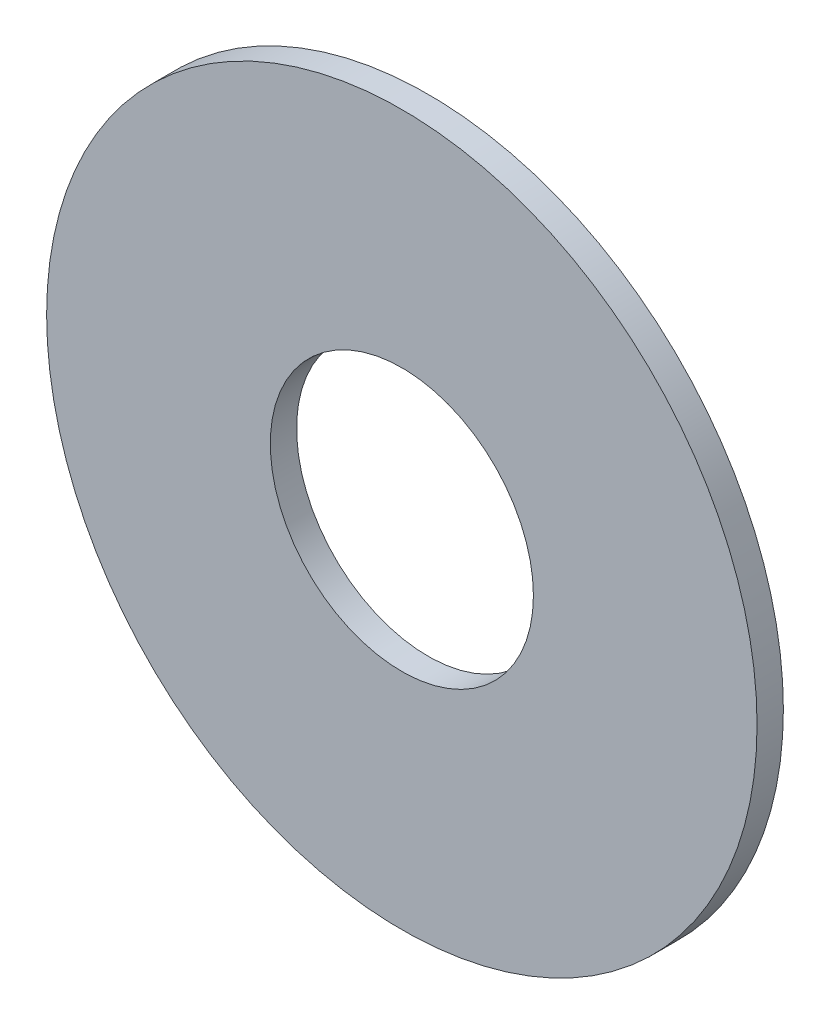
ISO-10303-21;
HEADER;
FILE_DESCRIPTION(('STEP AP214'),'2;1');
FILE_NAME('part.step','',(''),(''),'','','');
FILE_SCHEMA(('AUTOMOTIVE_DESIGN { 1 0 10303 214 1 1 1 1 }'));
ENDSEC;
DATA;
#1=APPLICATION_CONTEXT('core data for automotive mechanical design processes');
#2=APPLICATION_PROTOCOL_DEFINITION('international standard','automotive_design',2000,#1);
#3=PRODUCT_CONTEXT('',#1,'mechanical');
#4=PRODUCT('Part','Part','',(#3));
#5=PRODUCT_RELATED_PRODUCT_CATEGORY('part','',(#4));
#6=PRODUCT_DEFINITION_FORMATION('','',#4);
#7=PRODUCT_DEFINITION_CONTEXT('part definition',#1,'design');
#8=PRODUCT_DEFINITION('design','',#6,#7);
#9=PRODUCT_DEFINITION_SHAPE('','',#8);
#10=(LENGTH_UNIT() NAMED_UNIT(*) SI_UNIT(.MILLI.,.METRE.));
#11=(NAMED_UNIT(*) PLANE_ANGLE_UNIT() SI_UNIT($,.RADIAN.));
#12=(NAMED_UNIT(*) SI_UNIT($,.STERADIAN.) SOLID_ANGLE_UNIT());
#13=UNCERTAINTY_MEASURE_WITH_UNIT(LENGTH_MEASURE(1.E-05),#10,'distance_accuracy_value','');
#14=(GEOMETRIC_REPRESENTATION_CONTEXT(3) GLOBAL_UNCERTAINTY_ASSIGNED_CONTEXT((#13)) GLOBAL_UNIT_ASSIGNED_CONTEXT((#10,
#11,#12)) REPRESENTATION_CONTEXT('',''));
#15=CARTESIAN_POINT('',(0.,0.,0.));
#16=DIRECTION('',(0.,0.,1.));
#17=DIRECTION('',(1.,0.,0.));
#18=AXIS2_PLACEMENT_3D('',#15,#16,#17);
#19=CARTESIAN_POINT('',(0.,0.,2.));
#20=DIRECTION('',(0.,0.,1.));
#21=DIRECTION('',(1.,0.,0.));
#22=AXIS2_PLACEMENT_3D('',#19,#20,#21);
#23=PLANE('',#22);
#24=CARTESIAN_POINT('',(0.,0.,2.));
#25=DIRECTION('',(0.,0.,1.));
#26=DIRECTION('',(1.,0.,0.));
#27=AXIS2_PLACEMENT_3D('',#24,#25,#26);
#28=CIRCLE('',#27,27.);
#29=CARTESIAN_POINT('',(27.,0.,2.));
#30=VERTEX_POINT('',#29);
#31=EDGE_CURVE('E10',#30,#30,#28,.T.);
#32=ORIENTED_EDGE('',*,*,#31,.T.);
#33=EDGE_LOOP('',(#32));
#34=FACE_BOUND('',#33,.T.);
#35=CARTESIAN_POINT('',(0.,0.,2.));
#36=DIRECTION('',(0.,0.,1.));
#37=DIRECTION('',(1.,0.,0.));
#38=AXIS2_PLACEMENT_3D('',#35,#36,#37);
#39=CIRCLE('',#38,10.);
#40=CARTESIAN_POINT('',(10.,0.,2.));
#41=VERTEX_POINT('',#40);
#42=EDGE_CURVE('E41',#41,#41,#39,.T.);
#43=ORIENTED_EDGE('',*,*,#42,.F.);
#44=EDGE_LOOP('',(#43));
#45=FACE_BOUND('',#44,.T.);
#46=ADVANCED_FACE('F30',(#34,#45),#23,.T.);
#47=CARTESIAN_POINT('',(0.,0.,0.));
#48=DIRECTION('',(0.,0.,1.));
#49=DIRECTION('',(1.,0.,0.));
#50=AXIS2_PLACEMENT_3D('',#47,#48,#49);
#51=PLANE('',#50);
#52=CARTESIAN_POINT('',(0.,0.,0.));
#53=DIRECTION('',(0.,0.,1.));
#54=DIRECTION('',(1.,0.,0.));
#55=AXIS2_PLACEMENT_3D('',#52,#53,#54);
#56=CIRCLE('',#55,27.);
#57=CARTESIAN_POINT('',(27.,0.,0.));
#58=VERTEX_POINT('',#57);
#59=EDGE_CURVE('E34',#58,#58,#56,.T.);
#60=ORIENTED_EDGE('',*,*,#59,.F.);
#61=EDGE_LOOP('',(#60));
#62=FACE_BOUND('',#61,.T.);
#63=CARTESIAN_POINT('',(0.,0.,0.));
#64=DIRECTION('',(0.,0.,1.));
#65=DIRECTION('',(1.,0.,0.));
#66=AXIS2_PLACEMENT_3D('',#63,#64,#65);
#67=CIRCLE('',#66,10.);
#68=CARTESIAN_POINT('',(10.,0.,0.));
#69=VERTEX_POINT('',#68);
#70=EDGE_CURVE('E43',#69,#69,#67,.T.);
#71=ORIENTED_EDGE('',*,*,#70,.T.);
#72=EDGE_LOOP('',(#71));
#73=FACE_BOUND('',#72,.T.);
#74=ADVANCED_FACE('F53',(#62,#73),#51,.F.);
#75=CARTESIAN_POINT('',(0.,0.,2.));
#76=DIRECTION('',(0.,0.,-1.));
#77=DIRECTION('',(-1.,0.,0.));
#78=AXIS2_PLACEMENT_3D('',#75,#76,#77);
#79=CYLINDRICAL_SURFACE('',#78,27.);
#80=ORIENTED_EDGE('',*,*,#31,.F.);
#81=EDGE_LOOP('',(#80));
#82=FACE_BOUND('',#81,.T.);
#83=ORIENTED_EDGE('',*,*,#59,.T.);
#84=EDGE_LOOP('',(#83));
#85=FACE_BOUND('',#84,.T.);
#86=ADVANCED_FACE('F32',(#82,#85),#79,.T.);
#87=CARTESIAN_POINT('',(0.,0.,2.));
#88=DIRECTION('',(0.,0.,-1.));
#89=DIRECTION('',(-1.,0.,0.));
#90=AXIS2_PLACEMENT_3D('',#87,#88,#89);
#91=CYLINDRICAL_SURFACE('',#90,10.);
#92=ORIENTED_EDGE('',*,*,#42,.T.);
#93=EDGE_LOOP('',(#92));
#94=FACE_BOUND('',#93,.T.);
#95=ORIENTED_EDGE('',*,*,#70,.F.);
#96=EDGE_LOOP('',(#95));
#97=FACE_BOUND('',#96,.T.);
#98=ADVANCED_FACE('F49',(#94,#97),#91,.F.);
#99=CLOSED_SHELL('',(#46,#74,#86,#98));
#100=MANIFOLD_SOLID_BREP('B2',#99);
#101=ADVANCED_BREP_SHAPE_REPRESENTATION('',(#18,#100),#14);
#102=SHAPE_DEFINITION_REPRESENTATION(#9,#101);
ENDSEC;
END-ISO-10303-21;
